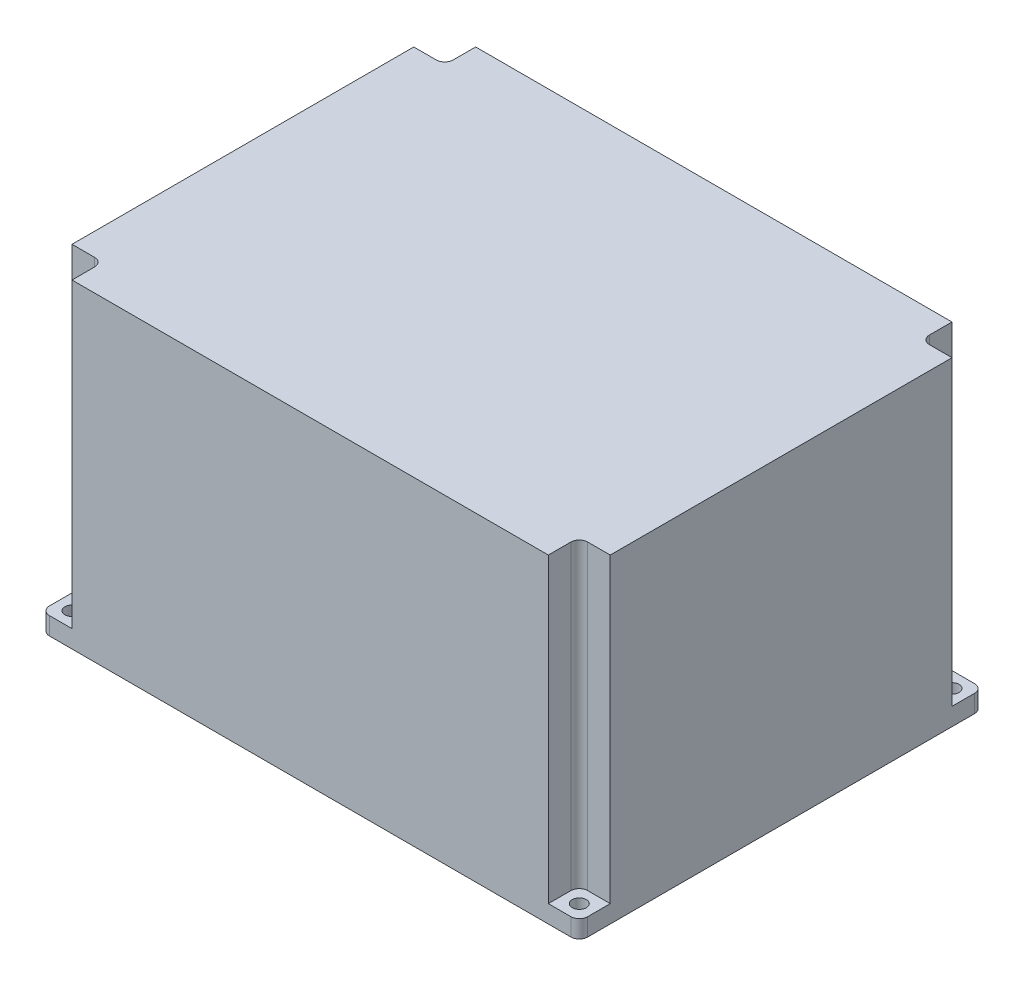
ISO-10303-21;
HEADER;
FILE_DESCRIPTION(('STEP AP214'),'2;1');
FILE_NAME('part.step','',(''),(''),'','','');
FILE_SCHEMA(('AUTOMOTIVE_DESIGN { 1 0 10303 214 1 1 1 1 }'));
ENDSEC;
DATA;
#1=APPLICATION_CONTEXT('core data for automotive mechanical design processes');
#2=APPLICATION_PROTOCOL_DEFINITION('international standard','automotive_design',2000,#1);
#3=PRODUCT_CONTEXT('',#1,'mechanical');
#4=PRODUCT('Part','Part','',(#3));
#5=PRODUCT_RELATED_PRODUCT_CATEGORY('part','',(#4));
#6=PRODUCT_DEFINITION_FORMATION('','',#4);
#7=PRODUCT_DEFINITION_CONTEXT('part definition',#1,'design');
#8=PRODUCT_DEFINITION('design','',#6,#7);
#9=PRODUCT_DEFINITION_SHAPE('','',#8);
#10=(LENGTH_UNIT() NAMED_UNIT(*) SI_UNIT(.MILLI.,.METRE.));
#11=(NAMED_UNIT(*) PLANE_ANGLE_UNIT() SI_UNIT($,.RADIAN.));
#12=(NAMED_UNIT(*) SI_UNIT($,.STERADIAN.) SOLID_ANGLE_UNIT());
#13=UNCERTAINTY_MEASURE_WITH_UNIT(LENGTH_MEASURE(1.E-05),#10,'distance_accuracy_value','');
#14=(GEOMETRIC_REPRESENTATION_CONTEXT(3) GLOBAL_UNCERTAINTY_ASSIGNED_CONTEXT((#13)) GLOBAL_UNIT_ASSIGNED_CONTEXT((#10,
#11,#12)) REPRESENTATION_CONTEXT('',''));
#15=CARTESIAN_POINT('',(0.,0.,0.));
#16=DIRECTION('',(0.,0.,1.));
#17=DIRECTION('',(1.,0.,0.));
#18=AXIS2_PLACEMENT_3D('',#15,#16,#17);
#19=CARTESIAN_POINT('',(51.0260115606936,95.,46.921965317919));
#20=DIRECTION('',(0.,-1.,0.));
#21=DIRECTION('',(0.,0.,-1.));
#22=AXIS2_PLACEMENT_3D('',#19,#20,#21);
#23=CYLINDRICAL_SURFACE('',#22,2.5);
#24=CARTESIAN_POINT('',(51.0260115606936,5.25,46.921965317919));
#25=DIRECTION('',(0.,1.,0.));
#26=DIRECTION('',(0.,0.,1.));
#27=AXIS2_PLACEMENT_3D('',#24,#25,#26);
#28=CIRCLE('',#27,2.5);
#29=CARTESIAN_POINT('',(51.0260115606936,5.25,49.4219653179191));
#30=VERTEX_POINT('',#29);
#31=CARTESIAN_POINT('',(53.5260115606936,5.25,46.921965317919));
#32=VERTEX_POINT('',#31);
#33=EDGE_CURVE('E402',#30,#32,#28,.T.);
#34=ORIENTED_EDGE('',*,*,#33,.F.);
#35=DIRECTION('',(0.,-1.,0.));
#36=VECTOR('',#35,1.);
#37=CARTESIAN_POINT('',(51.0260115606936,95.,49.4219653179191));
#38=LINE('',#37,#36);
#39=CARTESIAN_POINT('',(51.0260115606936,0.,49.4219653179191));
#40=VERTEX_POINT('',#39);
#41=EDGE_CURVE('E423',#30,#40,#38,.T.);
#42=ORIENTED_EDGE('',*,*,#41,.T.);
#43=CARTESIAN_POINT('',(51.0260115606936,0.,46.921965317919));
#44=DIRECTION('',(0.,1.,0.));
#45=DIRECTION('',(0.,0.,1.));
#46=AXIS2_PLACEMENT_3D('',#43,#44,#45);
#47=CIRCLE('',#46,2.5);
#48=CARTESIAN_POINT('',(53.5260115606936,0.,46.921965317919));
#49=VERTEX_POINT('',#48);
#50=EDGE_CURVE('E409',#40,#49,#47,.T.);
#51=ORIENTED_EDGE('',*,*,#50,.T.);
#52=DIRECTION('',(0.,-1.,0.));
#53=VECTOR('',#52,1.);
#54=CARTESIAN_POINT('',(53.5260115606936,95.,46.921965317919));
#55=LINE('',#54,#53);
#56=EDGE_CURVE('E11',#32,#49,#55,.T.);
#57=ORIENTED_EDGE('',*,*,#56,.F.);
#58=EDGE_LOOP('',(#34,#42,#51,#57));
#59=FACE_BOUND('',#58,.T.);
#60=ADVANCED_FACE('F36',(#59),#23,.T.);
#61=CARTESIAN_POINT('',(-103.973988439306,95.,-68.0780346820809));
#62=DIRECTION('',(0.,-1.,0.));
#63=DIRECTION('',(0.,0.,-1.));
#64=AXIS2_PLACEMENT_3D('',#61,#62,#63);
#65=CYLINDRICAL_SURFACE('',#64,2.5);
#66=CARTESIAN_POINT('',(-103.973988439306,5.25,-68.0780346820809));
#67=DIRECTION('',(0.,1.,0.));
#68=DIRECTION('',(0.,0.,1.));
#69=AXIS2_PLACEMENT_3D('',#66,#67,#68);
#70=CIRCLE('',#69,2.5);
#71=CARTESIAN_POINT('',(-103.973988439306,5.25,-70.5780346820809));
#72=VERTEX_POINT('',#71);
#73=CARTESIAN_POINT('',(-106.473988439306,5.25,-68.0780346820809));
#74=VERTEX_POINT('',#73);
#75=EDGE_CURVE('E404',#72,#74,#70,.T.);
#76=ORIENTED_EDGE('',*,*,#75,.F.);
#77=DIRECTION('',(0.,-1.,0.));
#78=VECTOR('',#77,1.);
#79=CARTESIAN_POINT('',(-103.973988439306,95.,-70.5780346820809));
#80=LINE('',#79,#78);
#81=CARTESIAN_POINT('',(-103.973988439306,0.,-70.5780346820809));
#82=VERTEX_POINT('',#81);
#83=EDGE_CURVE('E453',#72,#82,#80,.T.);
#84=ORIENTED_EDGE('',*,*,#83,.T.);
#85=CARTESIAN_POINT('',(-103.973988439306,0.,-68.0780346820809));
#86=DIRECTION('',(0.,1.,0.));
#87=DIRECTION('',(0.,0.,-1.));
#88=AXIS2_PLACEMENT_3D('',#85,#86,#87);
#89=CIRCLE('',#88,2.5);
#90=CARTESIAN_POINT('',(-106.473988439306,0.,-68.0780346820809));
#91=VERTEX_POINT('',#90);
#92=EDGE_CURVE('E435',#82,#91,#89,.T.);
#93=ORIENTED_EDGE('',*,*,#92,.T.);
#94=DIRECTION('',(0.,-1.,0.));
#95=VECTOR('',#94,1.);
#96=CARTESIAN_POINT('',(-106.473988439306,95.,-68.0780346820809));
#97=LINE('',#96,#95);
#98=EDGE_CURVE('E451',#74,#91,#97,.T.);
#99=ORIENTED_EDGE('',*,*,#98,.F.);
#100=EDGE_LOOP('',(#76,#84,#93,#99));
#101=FACE_BOUND('',#100,.T.);
#102=ADVANCED_FACE('F526',(#101),#65,.T.);
#103=CARTESIAN_POINT('',(53.5260115606936,95.,-68.0780346820809));
#104=DIRECTION('',(-1.,0.,0.));
#105=DIRECTION('',(0.,0.,1.));
#106=AXIS2_PLACEMENT_3D('',#103,#104,#105);
#107=PLANE('',#106);
#108=DIRECTION('',(0.,0.,-1.));
#109=VECTOR('',#108,1.);
#110=CARTESIAN_POINT('',(53.5260115606936,95.,-68.0780346820809));
#111=LINE('',#110,#109);
#112=CARTESIAN_POINT('',(53.5260115606936,95.,40.2219653179191));
#113=VERTEX_POINT('',#112);
#114=CARTESIAN_POINT('',(53.5260115606936,95.,-61.3780346820809));
#115=VERTEX_POINT('',#114);
#116=EDGE_CURVE('E410',#113,#115,#111,.T.);
#117=ORIENTED_EDGE('',*,*,#116,.F.);
#118=DIRECTION('',(0.,1.,0.));
#119=VECTOR('',#118,1.);
#120=CARTESIAN_POINT('',(53.5260115606936,5.25,40.2219653179191));
#121=LINE('',#120,#119);
#122=CARTESIAN_POINT('',(53.5260115606936,5.25,40.2219653179191));
#123=VERTEX_POINT('',#122);
#124=EDGE_CURVE('E364',#123,#113,#121,.T.);
#125=ORIENTED_EDGE('',*,*,#124,.F.);
#126=DIRECTION('',(0.,0.,-1.));
#127=VECTOR('',#126,1.);
#128=CARTESIAN_POINT('',(53.5260115606936,5.25,49.4219653179191));
#129=LINE('',#128,#127);
#130=EDGE_CURVE('E352',#32,#123,#129,.T.);
#131=ORIENTED_EDGE('',*,*,#130,.F.);
#132=ORIENTED_EDGE('',*,*,#56,.T.);
#133=DIRECTION('',(0.,0.,-1.));
#134=VECTOR('',#133,1.);
#135=CARTESIAN_POINT('',(53.5260115606936,0.,-68.0780346820809));
#136=LINE('',#135,#134);
#137=CARTESIAN_POINT('',(53.5260115606936,0.,-68.0780346820809));
#138=VERTEX_POINT('',#137);
#139=EDGE_CURVE('E426',#49,#138,#136,.T.);
#140=ORIENTED_EDGE('',*,*,#139,.T.);
#141=DIRECTION('',(0.,-1.,0.));
#142=VECTOR('',#141,1.);
#143=CARTESIAN_POINT('',(53.5260115606936,95.,-68.0780346820809));
#144=LINE('',#143,#142);
#145=CARTESIAN_POINT('',(53.5260115606936,5.25,-68.0780346820809));
#146=VERTEX_POINT('',#145);
#147=EDGE_CURVE('E43',#146,#138,#144,.T.);
#148=ORIENTED_EDGE('',*,*,#147,.F.);
#149=DIRECTION('',(0.,0.,-1.));
#150=VECTOR('',#149,1.);
#151=CARTESIAN_POINT('',(53.5260115606936,5.25,-70.5780346820809));
#152=LINE('',#151,#150);
#153=CARTESIAN_POINT('',(53.5260115606936,5.25,-61.3780346820809));
#154=VERTEX_POINT('',#153);
#155=EDGE_CURVE('E382',#154,#146,#152,.T.);
#156=ORIENTED_EDGE('',*,*,#155,.F.);
#157=DIRECTION('',(0.,1.,0.));
#158=VECTOR('',#157,1.);
#159=CARTESIAN_POINT('',(53.5260115606936,5.25,-61.3780346820809));
#160=LINE('',#159,#158);
#161=EDGE_CURVE('E391',#154,#115,#160,.T.);
#162=ORIENTED_EDGE('',*,*,#161,.T.);
#163=EDGE_LOOP('',(#117,#125,#131,#132,#140,#148,#156,#162));
#164=FACE_BOUND('',#163,.T.);
#165=ADVANCED_FACE('F466',(#164),#107,.F.);
#166=CARTESIAN_POINT('',(51.0260115606936,95.,-68.0780346820809));
#167=DIRECTION('',(0.,-1.,0.));
#168=DIRECTION('',(0.,0.,-1.));
#169=AXIS2_PLACEMENT_3D('',#166,#167,#168);
#170=CYLINDRICAL_SURFACE('',#169,2.5);
#171=DIRECTION('',(0.,-1.,0.));
#172=VECTOR('',#171,1.);
#173=CARTESIAN_POINT('',(51.0260115606936,95.,-70.5780346820809));
#174=LINE('',#173,#172);
#175=CARTESIAN_POINT('',(51.0260115606936,5.25,-70.5780346820809));
#176=VERTEX_POINT('',#175);
#177=CARTESIAN_POINT('',(51.0260115606936,0.,-70.5780346820809));
#178=VERTEX_POINT('',#177);
#179=EDGE_CURVE('E455',#176,#178,#174,.T.);
#180=ORIENTED_EDGE('',*,*,#179,.F.);
#181=CARTESIAN_POINT('',(51.0260115606936,5.25,-68.0780346820809));
#182=DIRECTION('',(0.,-1.,0.));
#183=DIRECTION('',(0.,0.,-1.));
#184=AXIS2_PLACEMENT_3D('',#181,#182,#183);
#185=CIRCLE('',#184,2.5);
#186=EDGE_CURVE('E406',#176,#146,#185,.T.);
#187=ORIENTED_EDGE('',*,*,#186,.T.);
#188=ORIENTED_EDGE('',*,*,#147,.T.);
#189=CARTESIAN_POINT('',(51.0260115606936,0.,-68.0780346820809));
#190=DIRECTION('',(0.,1.,0.));
#191=DIRECTION('',(0.,0.,1.));
#192=AXIS2_PLACEMENT_3D('',#189,#190,#191);
#193=CIRCLE('',#192,2.5);
#194=EDGE_CURVE('E429',#138,#178,#193,.T.);
#195=ORIENTED_EDGE('',*,*,#194,.T.);
#196=EDGE_LOOP('',(#180,#187,#188,#195));
#197=FACE_BOUND('',#196,.T.);
#198=ADVANCED_FACE('F459',(#197),#170,.T.);
#199=CARTESIAN_POINT('',(-103.973988439306,95.,-70.5780346820809));
#200=DIRECTION('',(0.,0.,1.));
#201=DIRECTION('',(1.,0.,0.));
#202=AXIS2_PLACEMENT_3D('',#199,#200,#201);
#203=PLANE('',#202);
#204=DIRECTION('',(-1.,0.,0.));
#205=VECTOR('',#204,1.);
#206=CARTESIAN_POINT('',(-106.473988439306,5.25,-70.5780346820809));
#207=LINE('',#206,#205);
#208=CARTESIAN_POINT('',(-97.2739884393064,5.25,-70.5780346820809));
#209=VERTEX_POINT('',#208);
#210=EDGE_CURVE('E288',#209,#72,#207,.T.);
#211=ORIENTED_EDGE('',*,*,#210,.F.);
#212=DIRECTION('',(0.,1.,0.));
#213=VECTOR('',#212,1.);
#214=CARTESIAN_POINT('',(-97.2739884393064,5.25,-70.5780346820809));
#215=LINE('',#214,#213);
#216=CARTESIAN_POINT('',(-97.2739884393064,95.,-70.5780346820809));
#217=VERTEX_POINT('',#216);
#218=EDGE_CURVE('E308',#209,#217,#215,.T.);
#219=ORIENTED_EDGE('',*,*,#218,.T.);
#220=DIRECTION('',(-1.,0.,0.));
#221=VECTOR('',#220,1.);
#222=CARTESIAN_POINT('',(-103.973988439306,95.,-70.5780346820809));
#223=LINE('',#222,#221);
#224=CARTESIAN_POINT('',(44.3260115606936,95.,-70.5780346820809));
#225=VERTEX_POINT('',#224);
#226=EDGE_CURVE('E413',#225,#217,#223,.T.);
#227=ORIENTED_EDGE('',*,*,#226,.F.);
#228=DIRECTION('',(0.,1.,0.));
#229=VECTOR('',#228,1.);
#230=CARTESIAN_POINT('',(44.3260115606936,5.25,-70.5780346820809));
#231=LINE('',#230,#229);
#232=CARTESIAN_POINT('',(44.3260115606936,5.25,-70.5780346820809));
#233=VERTEX_POINT('',#232);
#234=EDGE_CURVE('E384',#233,#225,#231,.T.);
#235=ORIENTED_EDGE('',*,*,#234,.F.);
#236=DIRECTION('',(-1.,0.,0.));
#237=VECTOR('',#236,1.);
#238=CARTESIAN_POINT('',(53.5260115606936,5.25,-70.5780346820809));
#239=LINE('',#238,#237);
#240=EDGE_CURVE('E370',#176,#233,#239,.T.);
#241=ORIENTED_EDGE('',*,*,#240,.F.);
#242=ORIENTED_EDGE('',*,*,#179,.T.);
#243=DIRECTION('',(-1.,0.,0.));
#244=VECTOR('',#243,1.);
#245=CARTESIAN_POINT('',(-103.973988439306,0.,-70.5780346820809));
#246=LINE('',#245,#244);
#247=EDGE_CURVE('E432',#178,#82,#246,.T.);
#248=ORIENTED_EDGE('',*,*,#247,.T.);
#249=ORIENTED_EDGE('',*,*,#83,.F.);
#250=EDGE_LOOP('',(#211,#219,#227,#235,#241,#242,#248,#249));
#251=FACE_BOUND('',#250,.T.);
#252=ADVANCED_FACE('F477',(#251),#203,.F.);
#253=CARTESIAN_POINT('',(-106.473988439306,95.,-68.0780346820809));
#254=DIRECTION('',(1.,0.,0.));
#255=DIRECTION('',(0.,0.,-1.));
#256=AXIS2_PLACEMENT_3D('',#253,#254,#255);
#257=PLANE('',#256);
#258=DIRECTION('',(0.,0.,1.));
#259=VECTOR('',#258,1.);
#260=CARTESIAN_POINT('',(-106.473988439306,5.25,-55.5780346820809));
#261=LINE('',#260,#259);
#262=CARTESIAN_POINT('',(-106.473988439306,5.25,-55.5780346820809));
#263=VERTEX_POINT('',#262);
#264=CARTESIAN_POINT('',(-106.473988439306,5.25,34.4219653179191));
#265=VERTEX_POINT('',#264);
#266=EDGE_CURVE('E248',#263,#265,#261,.T.);
#267=ORIENTED_EDGE('',*,*,#266,.F.);
#268=DIRECTION('',(0.,-1.,0.));
#269=VECTOR('',#268,1.);
#270=CARTESIAN_POINT('',(-106.473988439306,61.,-55.5780346820809));
#271=LINE('',#270,#269);
#272=CARTESIAN_POINT('',(-106.473988439306,61.,-55.5780346820809));
#273=VERTEX_POINT('',#272);
#274=EDGE_CURVE('E50',#273,#263,#271,.T.);
#275=ORIENTED_EDGE('',*,*,#274,.F.);
#276=DIRECTION('',(0.,0.,-1.));
#277=VECTOR('',#276,1.);
#278=CARTESIAN_POINT('',(-106.473988439306,61.,-55.5780346820809));
#279=LINE('',#278,#277);
#280=CARTESIAN_POINT('',(-106.473988439306,61.,34.4219653179191));
#281=VERTEX_POINT('',#280);
#282=EDGE_CURVE('E239',#281,#273,#279,.T.);
#283=ORIENTED_EDGE('',*,*,#282,.F.);
#284=DIRECTION('',(0.,1.,0.));
#285=VECTOR('',#284,1.);
#286=CARTESIAN_POINT('',(-106.473988439306,61.,34.4219653179191));
#287=LINE('',#286,#285);
#288=EDGE_CURVE('E242',#265,#281,#287,.T.);
#289=ORIENTED_EDGE('',*,*,#288,.F.);
#290=EDGE_LOOP('',(#267,#275,#283,#289));
#291=FACE_BOUND('',#290,.T.);
#292=DIRECTION('',(0.,0.,1.));
#293=VECTOR('',#292,1.);
#294=CARTESIAN_POINT('',(-106.473988439306,5.25,49.4219653179191));
#295=LINE('',#294,#293);
#296=CARTESIAN_POINT('',(-106.473988439306,5.25,40.2219653179191));
#297=VERTEX_POINT('',#296);
#298=CARTESIAN_POINT('',(-106.473988439306,5.25,46.9219653179191));
#299=VERTEX_POINT('',#298);
#300=EDGE_CURVE('E320',#297,#299,#295,.T.);
#301=ORIENTED_EDGE('',*,*,#300,.F.);
#302=DIRECTION('',(0.,1.,0.));
#303=VECTOR('',#302,1.);
#304=CARTESIAN_POINT('',(-106.473988439306,5.25,40.2219653179191));
#305=LINE('',#304,#303);
#306=CARTESIAN_POINT('',(-106.473988439306,95.,40.2219653179191));
#307=VERTEX_POINT('',#306);
#308=EDGE_CURVE('E338',#297,#307,#305,.T.);
#309=ORIENTED_EDGE('',*,*,#308,.T.);
#310=DIRECTION('',(0.,0.,1.));
#311=VECTOR('',#310,1.);
#312=CARTESIAN_POINT('',(-106.473988439306,95.,-68.0780346820809));
#313=LINE('',#312,#311);
#314=CARTESIAN_POINT('',(-106.473988439306,95.,-61.3780346820809));
#315=VERTEX_POINT('',#314);
#316=EDGE_CURVE('E417',#315,#307,#313,.T.);
#317=ORIENTED_EDGE('',*,*,#316,.F.);
#318=DIRECTION('',(0.,1.,0.));
#319=VECTOR('',#318,1.);
#320=CARTESIAN_POINT('',(-106.473988439306,5.25,-61.3780346820809));
#321=LINE('',#320,#319);
#322=CARTESIAN_POINT('',(-106.473988439306,5.25,-61.3780346820809));
#323=VERTEX_POINT('',#322);
#324=EDGE_CURVE('E306',#323,#315,#321,.T.);
#325=ORIENTED_EDGE('',*,*,#324,.F.);
#326=DIRECTION('',(0.,0.,1.));
#327=VECTOR('',#326,1.);
#328=CARTESIAN_POINT('',(-106.473988439306,5.25,-70.5780346820809));
#329=LINE('',#328,#327);
#330=EDGE_CURVE('E290',#74,#323,#329,.T.);
#331=ORIENTED_EDGE('',*,*,#330,.F.);
#332=ORIENTED_EDGE('',*,*,#98,.T.);
#333=DIRECTION('',(0.,0.,1.));
#334=VECTOR('',#333,1.);
#335=CARTESIAN_POINT('',(-106.473988439306,0.,-68.0780346820809));
#336=LINE('',#335,#334);
#337=CARTESIAN_POINT('',(-106.473988439306,0.,46.921965317919));
#338=VERTEX_POINT('',#337);
#339=EDGE_CURVE('E438',#91,#338,#336,.T.);
#340=ORIENTED_EDGE('',*,*,#339,.T.);
#341=DIRECTION('',(0.,-1.,0.));
#342=VECTOR('',#341,1.);
#343=CARTESIAN_POINT('',(-106.473988439306,95.,46.921965317919));
#344=LINE('',#343,#342);
#345=EDGE_CURVE('E449',#299,#338,#344,.T.);
#346=ORIENTED_EDGE('',*,*,#345,.F.);
#347=EDGE_LOOP('',(#301,#309,#317,#325,#331,#332,#340,#346));
#348=FACE_BOUND('',#347,.T.);
#349=ADVANCED_FACE('F520',(#291,#348),#257,.F.);
#350=CARTESIAN_POINT('',(-103.973988439306,95.,46.9219653179191));
#351=DIRECTION('',(0.,-1.,0.));
#352=DIRECTION('',(0.,0.,-1.));
#353=AXIS2_PLACEMENT_3D('',#350,#351,#352);
#354=CYLINDRICAL_SURFACE('',#353,2.5);
#355=DIRECTION('',(0.,-1.,0.));
#356=VECTOR('',#355,1.);
#357=CARTESIAN_POINT('',(-103.973988439306,95.,49.4219653179191));
#358=LINE('',#357,#356);
#359=CARTESIAN_POINT('',(-103.973988439306,5.25,49.4219653179191));
#360=VERTEX_POINT('',#359);
#361=CARTESIAN_POINT('',(-103.973988439306,0.,49.4219653179191));
#362=VERTEX_POINT('',#361);
#363=EDGE_CURVE('E447',#360,#362,#358,.T.);
#364=ORIENTED_EDGE('',*,*,#363,.F.);
#365=CARTESIAN_POINT('',(-103.973988439306,5.25,46.9219653179191));
#366=DIRECTION('',(0.,-1.,0.));
#367=DIRECTION('',(0.,0.,-1.));
#368=AXIS2_PLACEMENT_3D('',#365,#366,#367);
#369=CIRCLE('',#368,2.5);
#370=EDGE_CURVE('E394',#360,#299,#369,.T.);
#371=ORIENTED_EDGE('',*,*,#370,.T.);
#372=ORIENTED_EDGE('',*,*,#345,.T.);
#373=CARTESIAN_POINT('',(-103.973988439306,0.,46.9219653179191));
#374=DIRECTION('',(0.,1.,0.));
#375=DIRECTION('',(0.,0.,-1.));
#376=AXIS2_PLACEMENT_3D('',#373,#374,#375);
#377=CIRCLE('',#376,2.5);
#378=EDGE_CURVE('E441',#338,#362,#377,.T.);
#379=ORIENTED_EDGE('',*,*,#378,.T.);
#380=EDGE_LOOP('',(#364,#371,#372,#379));
#381=FACE_BOUND('',#380,.T.);
#382=ADVANCED_FACE('F516',(#381),#354,.T.);
#383=CARTESIAN_POINT('',(-103.973988439306,95.,49.4219653179191));
#384=DIRECTION('',(0.,0.,-1.));
#385=DIRECTION('',(-1.,0.,0.));
#386=AXIS2_PLACEMENT_3D('',#383,#384,#385);
#387=PLANE('',#386);
#388=DIRECTION('',(1.,0.,0.));
#389=VECTOR('',#388,1.);
#390=CARTESIAN_POINT('',(53.5260115606936,5.25,49.4219653179191));
#391=LINE('',#390,#389);
#392=CARTESIAN_POINT('',(44.3260115606936,5.25,49.4219653179191));
#393=VERTEX_POINT('',#392);
#394=EDGE_CURVE('E350',#393,#30,#391,.T.);
#395=ORIENTED_EDGE('',*,*,#394,.F.);
#396=DIRECTION('',(0.,1.,0.));
#397=VECTOR('',#396,1.);
#398=CARTESIAN_POINT('',(44.3260115606936,5.25,49.4219653179191));
#399=LINE('',#398,#397);
#400=CARTESIAN_POINT('',(44.3260115606936,95.,49.4219653179191));
#401=VERTEX_POINT('',#400);
#402=EDGE_CURVE('E366',#393,#401,#399,.T.);
#403=ORIENTED_EDGE('',*,*,#402,.T.);
#404=DIRECTION('',(1.,0.,0.));
#405=VECTOR('',#404,1.);
#406=CARTESIAN_POINT('',(-103.973988439306,95.,49.4219653179191));
#407=LINE('',#406,#405);
#408=CARTESIAN_POINT('',(-97.2739884393064,95.,49.4219653179191));
#409=VERTEX_POINT('',#408);
#410=EDGE_CURVE('E420',#409,#401,#407,.T.);
#411=ORIENTED_EDGE('',*,*,#410,.F.);
#412=DIRECTION('',(0.,1.,0.));
#413=VECTOR('',#412,1.);
#414=CARTESIAN_POINT('',(-97.2739884393064,5.25,49.4219653179191));
#415=LINE('',#414,#413);
#416=CARTESIAN_POINT('',(-97.2739884393064,5.25,49.4219653179191));
#417=VERTEX_POINT('',#416);
#418=EDGE_CURVE('E336',#417,#409,#415,.T.);
#419=ORIENTED_EDGE('',*,*,#418,.F.);
#420=DIRECTION('',(1.,0.,0.));
#421=VECTOR('',#420,1.);
#422=CARTESIAN_POINT('',(-106.473988439306,5.25,49.4219653179191));
#423=LINE('',#422,#421);
#424=EDGE_CURVE('E322',#360,#417,#423,.T.);
#425=ORIENTED_EDGE('',*,*,#424,.F.);
#426=ORIENTED_EDGE('',*,*,#363,.T.);
#427=DIRECTION('',(1.,0.,0.));
#428=VECTOR('',#427,1.);
#429=CARTESIAN_POINT('',(-103.973988439306,0.,49.4219653179191));
#430=LINE('',#429,#428);
#431=EDGE_CURVE('E414',#362,#40,#430,.T.);
#432=ORIENTED_EDGE('',*,*,#431,.T.);
#433=ORIENTED_EDGE('',*,*,#41,.F.);
#434=EDGE_LOOP('',(#395,#403,#411,#419,#425,#426,#432,#433));
#435=FACE_BOUND('',#434,.T.);
#436=ADVANCED_FACE('F511',(#435),#387,.F.);
#437=CARTESIAN_POINT('',(51.0260115606936,95.,46.921965317919));
#438=DIRECTION('',(0.,1.,0.));
#439=DIRECTION('',(0.,0.,1.));
#440=AXIS2_PLACEMENT_3D('',#437,#438,#439);
#441=PLANE('',#440);
#442=DIRECTION('',(-1.,0.,0.));
#443=VECTOR('',#442,1.);
#444=CARTESIAN_POINT('',(53.5260115606936,95.,40.2219653179191));
#445=LINE('',#444,#443);
#446=CARTESIAN_POINT('',(46.8260115606937,95.,40.2219653179191));
#447=VERTEX_POINT('',#446);
#448=EDGE_CURVE('E347',#113,#447,#445,.T.);
#449=ORIENTED_EDGE('',*,*,#448,.F.);
#450=ORIENTED_EDGE('',*,*,#116,.T.);
#451=DIRECTION('',(1.,0.,0.));
#452=VECTOR('',#451,1.);
#453=CARTESIAN_POINT('',(53.5260115606936,95.,-61.3780346820809));
#454=LINE('',#453,#452);
#455=CARTESIAN_POINT('',(46.8260115606937,95.,-61.3780346820809));
#456=VERTEX_POINT('',#455);
#457=EDGE_CURVE('E373',#456,#115,#454,.T.);
#458=ORIENTED_EDGE('',*,*,#457,.F.);
#459=CARTESIAN_POINT('',(46.8260115606936,95.,-63.8780346820809));
#460=DIRECTION('',(0.,1.,0.));
#461=DIRECTION('',(0.,0.,-1.));
#462=AXIS2_PLACEMENT_3D('',#459,#460,#461);
#463=CIRCLE('',#462,2.5);
#464=CARTESIAN_POINT('',(44.3260115606936,95.,-63.8780346820809));
#465=VERTEX_POINT('',#464);
#466=EDGE_CURVE('E387',#465,#456,#463,.T.);
#467=ORIENTED_EDGE('',*,*,#466,.F.);
#468=DIRECTION('',(0.,0.,1.));
#469=VECTOR('',#468,1.);
#470=CARTESIAN_POINT('',(44.3260115606936,95.,-63.8780346820809));
#471=LINE('',#470,#469);
#472=EDGE_CURVE('E305',#225,#465,#471,.T.);
#473=ORIENTED_EDGE('',*,*,#472,.F.);
#474=ORIENTED_EDGE('',*,*,#226,.T.);
#475=DIRECTION('',(0.,0.,-1.));
#476=VECTOR('',#475,1.);
#477=CARTESIAN_POINT('',(-97.2739884393064,95.,-63.8780346820809));
#478=LINE('',#477,#476);
#479=CARTESIAN_POINT('',(-97.2739884393064,95.,-63.8780346820809));
#480=VERTEX_POINT('',#479);
#481=EDGE_CURVE('E298',#480,#217,#478,.T.);
#482=ORIENTED_EDGE('',*,*,#481,.F.);
#483=CARTESIAN_POINT('',(-99.7739884393064,95.,-63.8780346820809));
#484=DIRECTION('',(0.,1.,0.));
#485=DIRECTION('',(0.,0.,1.));
#486=AXIS2_PLACEMENT_3D('',#483,#484,#485);
#487=CIRCLE('',#486,2.5);
#488=CARTESIAN_POINT('',(-99.7739884393064,95.,-61.3780346820809));
#489=VERTEX_POINT('',#488);
#490=EDGE_CURVE('E296',#489,#480,#487,.T.);
#491=ORIENTED_EDGE('',*,*,#490,.F.);
#492=DIRECTION('',(1.,0.,0.));
#493=VECTOR('',#492,1.);
#494=CARTESIAN_POINT('',(-106.473988439306,95.,-61.3780346820809));
#495=LINE('',#494,#493);
#496=EDGE_CURVE('E285',#315,#489,#495,.T.);
#497=ORIENTED_EDGE('',*,*,#496,.F.);
#498=ORIENTED_EDGE('',*,*,#316,.T.);
#499=DIRECTION('',(-1.,0.,0.));
#500=VECTOR('',#499,1.);
#501=CARTESIAN_POINT('',(-106.473988439306,95.,40.2219653179191));
#502=LINE('',#501,#500);
#503=CARTESIAN_POINT('',(-99.7739884393064,95.,40.2219653179191));
#504=VERTEX_POINT('',#503);
#505=EDGE_CURVE('E330',#504,#307,#502,.T.);
#506=ORIENTED_EDGE('',*,*,#505,.F.);
#507=CARTESIAN_POINT('',(-99.7739884393064,95.,42.7219653179191));
#508=DIRECTION('',(0.,1.,0.));
#509=DIRECTION('',(0.,0.,-1.));
#510=AXIS2_PLACEMENT_3D('',#507,#508,#509);
#511=CIRCLE('',#510,2.5);
#512=CARTESIAN_POINT('',(-97.2739884393064,95.,42.7219653179191));
#513=VERTEX_POINT('',#512);
#514=EDGE_CURVE('E328',#513,#504,#511,.T.);
#515=ORIENTED_EDGE('',*,*,#514,.F.);
#516=DIRECTION('',(0.,0.,-1.));
#517=VECTOR('',#516,1.);
#518=CARTESIAN_POINT('',(-97.2739884393064,95.,42.7219653179191));
#519=LINE('',#518,#517);
#520=EDGE_CURVE('E317',#409,#513,#519,.T.);
#521=ORIENTED_EDGE('',*,*,#520,.F.);
#522=ORIENTED_EDGE('',*,*,#410,.T.);
#523=DIRECTION('',(0.,0.,1.));
#524=VECTOR('',#523,1.);
#525=CARTESIAN_POINT('',(44.3260115606936,95.,42.7219653179191));
#526=LINE('',#525,#524);
#527=CARTESIAN_POINT('',(44.3260115606936,95.,42.7219653179191));
#528=VERTEX_POINT('',#527);
#529=EDGE_CURVE('E359',#528,#401,#526,.T.);
#530=ORIENTED_EDGE('',*,*,#529,.F.);
#531=CARTESIAN_POINT('',(46.8260115606936,95.,42.7219653179191));
#532=DIRECTION('',(0.,1.,0.));
#533=DIRECTION('',(0.,0.,1.));
#534=AXIS2_PLACEMENT_3D('',#531,#532,#533);
#535=CIRCLE('',#534,2.5);
#536=EDGE_CURVE('E58',#447,#528,#535,.T.);
#537=ORIENTED_EDGE('',*,*,#536,.F.);
#538=EDGE_LOOP('',(#449,#450,#458,#467,#473,#474,#482,#491,#497,#498,#506,#515,#521,#522,#530,#537));
#539=FACE_BOUND('',#538,.T.);
#540=ADVANCED_FACE('F497',(#539),#441,.T.);
#541=CARTESIAN_POINT('',(51.0260115606936,0.,46.921965317919));
#542=DIRECTION('',(0.,1.,0.));
#543=DIRECTION('',(0.,0.,1.));
#544=AXIS2_PLACEMENT_3D('',#541,#542,#543);
#545=PLANE('',#544);
#546=CARTESIAN_POINT('',(48.9260115606936,0.,44.8219653179191));
#547=DIRECTION('',(0.,1.,0.));
#548=DIRECTION('',(0.,0.,1.));
#549=AXIS2_PLACEMENT_3D('',#546,#547,#548);
#550=CIRCLE('',#549,2.1);
#551=CARTESIAN_POINT('',(48.9260115606936,0.,46.9219653179191));
#552=VERTEX_POINT('',#551);
#553=EDGE_CURVE('E269',#552,#552,#550,.F.);
#554=ORIENTED_EDGE('',*,*,#553,.F.);
#555=EDGE_LOOP('',(#554));
#556=FACE_BOUND('',#555,.T.);
#557=CARTESIAN_POINT('',(-101.873988439306,0.,44.8219653179191));
#558=DIRECTION('',(0.,1.,0.));
#559=DIRECTION('',(0.,0.,1.));
#560=AXIS2_PLACEMENT_3D('',#557,#558,#559);
#561=CIRCLE('',#560,2.10000000000002);
#562=CARTESIAN_POINT('',(-101.873988439306,0.,46.9219653179191));
#563=VERTEX_POINT('',#562);
#564=EDGE_CURVE('E262',#563,#563,#561,.F.);
#565=ORIENTED_EDGE('',*,*,#564,.F.);
#566=EDGE_LOOP('',(#565));
#567=FACE_BOUND('',#566,.T.);
#568=CARTESIAN_POINT('',(-101.873988439306,0.,-65.9780346820809));
#569=DIRECTION('',(0.,1.,0.));
#570=DIRECTION('',(0.,0.,1.));
#571=AXIS2_PLACEMENT_3D('',#568,#569,#570);
#572=CIRCLE('',#571,2.10000000000002);
#573=CARTESIAN_POINT('',(-101.873988439306,0.,-63.8780346820809));
#574=VERTEX_POINT('',#573);
#575=EDGE_CURVE('E261',#574,#574,#572,.F.);
#576=ORIENTED_EDGE('',*,*,#575,.F.);
#577=EDGE_LOOP('',(#576));
#578=FACE_BOUND('',#577,.T.);
#579=CARTESIAN_POINT('',(48.9260115606936,0.,-65.9780346820809));
#580=DIRECTION('',(0.,1.,0.));
#581=DIRECTION('',(0.,0.,1.));
#582=AXIS2_PLACEMENT_3D('',#579,#580,#581);
#583=CIRCLE('',#582,2.1);
#584=CARTESIAN_POINT('',(48.9260115606936,0.,-63.8780346820809));
#585=VERTEX_POINT('',#584);
#586=EDGE_CURVE('E278',#585,#585,#583,.F.);
#587=ORIENTED_EDGE('',*,*,#586,.F.);
#588=EDGE_LOOP('',(#587));
#589=FACE_BOUND('',#588,.T.);
#590=ORIENTED_EDGE('',*,*,#50,.F.);
#591=ORIENTED_EDGE('',*,*,#431,.F.);
#592=ORIENTED_EDGE('',*,*,#378,.F.);
#593=ORIENTED_EDGE('',*,*,#339,.F.);
#594=ORIENTED_EDGE('',*,*,#92,.F.);
#595=ORIENTED_EDGE('',*,*,#247,.F.);
#596=ORIENTED_EDGE('',*,*,#194,.F.);
#597=ORIENTED_EDGE('',*,*,#139,.F.);
#598=EDGE_LOOP('',(#590,#591,#592,#593,#594,#595,#596,#597));
#599=FACE_BOUND('',#598,.T.);
#600=ADVANCED_FACE('F471',(#556,#567,#578,#589,#599),#545,.F.);
#601=CARTESIAN_POINT('',(46.8260115606936,5.25,-63.8780346820809));
#602=DIRECTION('',(0.,-1.,0.));
#603=DIRECTION('',(0.,0.,-1.));
#604=AXIS2_PLACEMENT_3D('',#601,#602,#603);
#605=PLANE('',#604);
#606=CARTESIAN_POINT('',(48.9260115606936,5.25,-65.9780346820809));
#607=DIRECTION('',(0.,1.,0.));
#608=DIRECTION('',(0.,0.,1.));
#609=AXIS2_PLACEMENT_3D('',#606,#607,#608);
#610=CIRCLE('',#609,2.1);
#611=CARTESIAN_POINT('',(48.9260115606936,5.25,-63.8780346820809));
#612=VERTEX_POINT('',#611);
#613=EDGE_CURVE('E265',#612,#612,#610,.T.);
#614=ORIENTED_EDGE('',*,*,#613,.F.);
#615=EDGE_LOOP('',(#614));
#616=FACE_BOUND('',#615,.T.);
#617=ORIENTED_EDGE('',*,*,#240,.T.);
#618=DIRECTION('',(0.,0.,1.));
#619=VECTOR('',#618,1.);
#620=CARTESIAN_POINT('',(44.3260115606936,5.25,-63.8780346820809));
#621=LINE('',#620,#619);
#622=CARTESIAN_POINT('',(44.3260115606936,5.25,-63.8780346820809));
#623=VERTEX_POINT('',#622);
#624=EDGE_CURVE('E372',#233,#623,#621,.T.);
#625=ORIENTED_EDGE('',*,*,#624,.T.);
#626=CARTESIAN_POINT('',(46.8260115606936,5.25,-63.8780346820809));
#627=DIRECTION('',(0.,1.,0.));
#628=DIRECTION('',(0.,0.,-1.));
#629=AXIS2_PLACEMENT_3D('',#626,#627,#628);
#630=CIRCLE('',#629,2.5);
#631=CARTESIAN_POINT('',(46.8260115606937,5.25,-61.3780346820809));
#632=VERTEX_POINT('',#631);
#633=EDGE_CURVE('E376',#623,#632,#630,.T.);
#634=ORIENTED_EDGE('',*,*,#633,.T.);
#635=DIRECTION('',(1.,0.,0.));
#636=VECTOR('',#635,1.);
#637=CARTESIAN_POINT('',(53.5260115606936,5.25,-61.3780346820809));
#638=LINE('',#637,#636);
#639=EDGE_CURVE('E379',#632,#154,#638,.T.);
#640=ORIENTED_EDGE('',*,*,#639,.T.);
#641=ORIENTED_EDGE('',*,*,#155,.T.);
#642=ORIENTED_EDGE('',*,*,#186,.F.);
#643=EDGE_LOOP('',(#617,#625,#634,#640,#641,#642));
#644=FACE_BOUND('',#643,.T.);
#645=ADVANCED_FACE('F483',(#616,#644),#605,.F.);
#646=CARTESIAN_POINT('',(53.5260115606936,5.25,-61.3780346820809));
#647=DIRECTION('',(0.,0.,1.));
#648=DIRECTION('',(1.,0.,0.));
#649=AXIS2_PLACEMENT_3D('',#646,#647,#648);
#650=PLANE('',#649);
#651=ORIENTED_EDGE('',*,*,#457,.T.);
#652=ORIENTED_EDGE('',*,*,#161,.F.);
#653=ORIENTED_EDGE('',*,*,#639,.F.);
#654=DIRECTION('',(0.,1.,0.));
#655=VECTOR('',#654,1.);
#656=CARTESIAN_POINT('',(46.8260115606937,5.25,-61.3780346820809));
#657=LINE('',#656,#655);
#658=EDGE_CURVE('E395',#632,#456,#657,.T.);
#659=ORIENTED_EDGE('',*,*,#658,.T.);
#660=EDGE_LOOP('',(#651,#652,#653,#659));
#661=FACE_BOUND('',#660,.T.);
#662=ADVANCED_FACE('F634',(#661),#650,.F.);
#663=CARTESIAN_POINT('',(46.8260115606936,5.25,-63.8780346820809));
#664=DIRECTION('',(0.,1.,0.));
#665=DIRECTION('',(0.,0.,1.));
#666=AXIS2_PLACEMENT_3D('',#663,#664,#665);
#667=CYLINDRICAL_SURFACE('',#666,2.5);
#668=ORIENTED_EDGE('',*,*,#466,.T.);
#669=ORIENTED_EDGE('',*,*,#658,.F.);
#670=ORIENTED_EDGE('',*,*,#633,.F.);
#671=DIRECTION('',(0.,1.,0.));
#672=VECTOR('',#671,1.);
#673=CARTESIAN_POINT('',(44.3260115606936,5.25,-63.8780346820809));
#674=LINE('',#673,#672);
#675=EDGE_CURVE('E397',#623,#465,#674,.T.);
#676=ORIENTED_EDGE('',*,*,#675,.T.);
#677=EDGE_LOOP('',(#668,#669,#670,#676));
#678=FACE_BOUND('',#677,.T.);
#679=ADVANCED_FACE('F490',(#678),#667,.F.);
#680=CARTESIAN_POINT('',(44.3260115606936,5.25,-63.8780346820809));
#681=DIRECTION('',(-1.,0.,0.));
#682=DIRECTION('',(0.,0.,1.));
#683=AXIS2_PLACEMENT_3D('',#680,#681,#682);
#684=PLANE('',#683);
#685=ORIENTED_EDGE('',*,*,#472,.T.);
#686=ORIENTED_EDGE('',*,*,#675,.F.);
#687=ORIENTED_EDGE('',*,*,#624,.F.);
#688=ORIENTED_EDGE('',*,*,#234,.T.);
#689=EDGE_LOOP('',(#685,#686,#687,#688));
#690=FACE_BOUND('',#689,.T.);
#691=ADVANCED_FACE('F485',(#690),#684,.F.);
#692=CARTESIAN_POINT('',(-99.7739884393064,5.25,-63.8780346820809));
#693=DIRECTION('',(0.,1.,0.));
#694=DIRECTION('',(0.,0.,1.));
#695=AXIS2_PLACEMENT_3D('',#692,#693,#694);
#696=PLANE('',#695);
#697=CARTESIAN_POINT('',(-101.873988439306,5.25,-65.9780346820809));
#698=DIRECTION('',(0.,1.,0.));
#699=DIRECTION('',(0.,0.,-1.));
#700=AXIS2_PLACEMENT_3D('',#697,#698,#699);
#701=CIRCLE('',#700,2.10000000000002);
#702=CARTESIAN_POINT('',(-101.873988439306,5.25,-68.0780346820809));
#703=VERTEX_POINT('',#702);
#704=EDGE_CURVE('E258',#703,#703,#701,.T.);
#705=ORIENTED_EDGE('',*,*,#704,.F.);
#706=EDGE_LOOP('',(#705));
#707=FACE_BOUND('',#706,.T.);
#708=ORIENTED_EDGE('',*,*,#75,.T.);
#709=ORIENTED_EDGE('',*,*,#330,.T.);
#710=DIRECTION('',(1.,0.,0.));
#711=VECTOR('',#710,1.);
#712=CARTESIAN_POINT('',(-106.473988439306,5.25,-61.3780346820809));
#713=LINE('',#712,#711);
#714=CARTESIAN_POINT('',(-99.7739884393064,5.25,-61.3780346820809));
#715=VERTEX_POINT('',#714);
#716=EDGE_CURVE('E292',#323,#715,#713,.T.);
#717=ORIENTED_EDGE('',*,*,#716,.T.);
#718=CARTESIAN_POINT('',(-99.7739884393064,5.25,-63.8780346820809));
#719=DIRECTION('',(0.,1.,0.));
#720=DIRECTION('',(0.,0.,1.));
#721=AXIS2_PLACEMENT_3D('',#718,#719,#720);
#722=CIRCLE('',#721,2.5);
#723=CARTESIAN_POINT('',(-97.2739884393064,5.25,-63.8780346820809));
#724=VERTEX_POINT('',#723);
#725=EDGE_CURVE('E281',#715,#724,#722,.T.);
#726=ORIENTED_EDGE('',*,*,#725,.T.);
#727=DIRECTION('',(0.,0.,-1.));
#728=VECTOR('',#727,1.);
#729=CARTESIAN_POINT('',(-97.2739884393064,5.25,-63.8780346820809));
#730=LINE('',#729,#728);
#731=EDGE_CURVE('E284',#724,#209,#730,.T.);
#732=ORIENTED_EDGE('',*,*,#731,.T.);
#733=ORIENTED_EDGE('',*,*,#210,.T.);
#734=EDGE_LOOP('',(#708,#709,#717,#726,#732,#733));
#735=FACE_BOUND('',#734,.T.);
#736=ADVANCED_FACE('F528',(#707,#735),#696,.T.);
#737=CARTESIAN_POINT('',(-99.7739884393064,5.25,-63.8780346820809));
#738=DIRECTION('',(0.,1.,0.));
#739=DIRECTION('',(0.,0.,1.));
#740=AXIS2_PLACEMENT_3D('',#737,#738,#739);
#741=CYLINDRICAL_SURFACE('',#740,2.5);
#742=ORIENTED_EDGE('',*,*,#490,.T.);
#743=DIRECTION('',(0.,1.,0.));
#744=VECTOR('',#743,1.);
#745=CARTESIAN_POINT('',(-97.2739884393064,5.25,-63.8780346820809));
#746=LINE('',#745,#744);
#747=EDGE_CURVE('E295',#724,#480,#746,.T.);
#748=ORIENTED_EDGE('',*,*,#747,.F.);
#749=ORIENTED_EDGE('',*,*,#725,.F.);
#750=DIRECTION('',(0.,1.,0.));
#751=VECTOR('',#750,1.);
#752=CARTESIAN_POINT('',(-99.7739884393064,5.25,-61.3780346820809));
#753=LINE('',#752,#751);
#754=EDGE_CURVE('E303',#715,#489,#753,.T.);
#755=ORIENTED_EDGE('',*,*,#754,.T.);
#756=EDGE_LOOP('',(#742,#748,#749,#755));
#757=FACE_BOUND('',#756,.T.);
#758=ADVANCED_FACE('F538',(#757),#741,.F.);
#759=CARTESIAN_POINT('',(-106.473988439306,5.25,-61.3780346820809));
#760=DIRECTION('',(0.,0.,1.));
#761=DIRECTION('',(1.,0.,0.));
#762=AXIS2_PLACEMENT_3D('',#759,#760,#761);
#763=PLANE('',#762);
#764=ORIENTED_EDGE('',*,*,#496,.T.);
#765=ORIENTED_EDGE('',*,*,#754,.F.);
#766=ORIENTED_EDGE('',*,*,#716,.F.);
#767=ORIENTED_EDGE('',*,*,#324,.T.);
#768=EDGE_LOOP('',(#764,#765,#766,#767));
#769=FACE_BOUND('',#768,.T.);
#770=ADVANCED_FACE('F540',(#769),#763,.F.);
#771=CARTESIAN_POINT('',(-97.2739884393064,5.25,-63.8780346820809));
#772=DIRECTION('',(1.,0.,0.));
#773=DIRECTION('',(0.,0.,-1.));
#774=AXIS2_PLACEMENT_3D('',#771,#772,#773);
#775=PLANE('',#774);
#776=ORIENTED_EDGE('',*,*,#481,.T.);
#777=ORIENTED_EDGE('',*,*,#218,.F.);
#778=ORIENTED_EDGE('',*,*,#731,.F.);
#779=ORIENTED_EDGE('',*,*,#747,.T.);
#780=EDGE_LOOP('',(#776,#777,#778,#779));
#781=FACE_BOUND('',#780,.T.);
#782=ADVANCED_FACE('F535',(#781),#775,.F.);
#783=CARTESIAN_POINT('',(-99.7739884393064,5.25,42.7219653179191));
#784=DIRECTION('',(0.,-1.,0.));
#785=DIRECTION('',(0.,0.,-1.));
#786=AXIS2_PLACEMENT_3D('',#783,#784,#785);
#787=PLANE('',#786);
#788=CARTESIAN_POINT('',(-101.873988439306,5.25,44.8219653179191));
#789=DIRECTION('',(0.,1.,0.));
#790=DIRECTION('',(0.,0.,1.));
#791=AXIS2_PLACEMENT_3D('',#788,#789,#790);
#792=CIRCLE('',#791,2.10000000000002);
#793=CARTESIAN_POINT('',(-101.873988439306,5.25,46.9219653179191));
#794=VERTEX_POINT('',#793);
#795=EDGE_CURVE('E266',#794,#794,#792,.T.);
#796=ORIENTED_EDGE('',*,*,#795,.F.);
#797=EDGE_LOOP('',(#796));
#798=FACE_BOUND('',#797,.T.);
#799=ORIENTED_EDGE('',*,*,#424,.T.);
#800=DIRECTION('',(0.,0.,-1.));
#801=VECTOR('',#800,1.);
#802=CARTESIAN_POINT('',(-97.2739884393064,5.25,42.7219653179191));
#803=LINE('',#802,#801);
#804=CARTESIAN_POINT('',(-97.2739884393064,5.25,42.7219653179191));
#805=VERTEX_POINT('',#804);
#806=EDGE_CURVE('E324',#417,#805,#803,.T.);
#807=ORIENTED_EDGE('',*,*,#806,.T.);
#808=CARTESIAN_POINT('',(-99.7739884393064,5.25,42.7219653179191));
#809=DIRECTION('',(0.,1.,0.));
#810=DIRECTION('',(0.,0.,-1.));
#811=AXIS2_PLACEMENT_3D('',#808,#809,#810);
#812=CIRCLE('',#811,2.5);
#813=CARTESIAN_POINT('',(-99.7739884393064,5.25,40.2219653179191));
#814=VERTEX_POINT('',#813);
#815=EDGE_CURVE('E313',#805,#814,#812,.T.);
#816=ORIENTED_EDGE('',*,*,#815,.T.);
#817=DIRECTION('',(-1.,0.,0.));
#818=VECTOR('',#817,1.);
#819=CARTESIAN_POINT('',(-106.473988439306,5.25,40.2219653179191));
#820=LINE('',#819,#818);
#821=EDGE_CURVE('E316',#814,#297,#820,.T.);
#822=ORIENTED_EDGE('',*,*,#821,.T.);
#823=ORIENTED_EDGE('',*,*,#300,.T.);
#824=ORIENTED_EDGE('',*,*,#370,.F.);
#825=EDGE_LOOP('',(#799,#807,#816,#822,#823,#824));
#826=FACE_BOUND('',#825,.T.);
#827=ADVANCED_FACE('F547',(#798,#826),#787,.F.);
#828=CARTESIAN_POINT('',(-99.7739884393064,5.25,42.7219653179191));
#829=DIRECTION('',(0.,1.,0.));
#830=DIRECTION('',(0.,0.,1.));
#831=AXIS2_PLACEMENT_3D('',#828,#829,#830);
#832=CYLINDRICAL_SURFACE('',#831,2.5);
#833=ORIENTED_EDGE('',*,*,#514,.T.);
#834=DIRECTION('',(0.,1.,0.));
#835=VECTOR('',#834,1.);
#836=CARTESIAN_POINT('',(-99.7739884393064,5.25,40.2219653179191));
#837=LINE('',#836,#835);
#838=EDGE_CURVE('E327',#814,#504,#837,.T.);
#839=ORIENTED_EDGE('',*,*,#838,.F.);
#840=ORIENTED_EDGE('',*,*,#815,.F.);
#841=DIRECTION('',(0.,1.,0.));
#842=VECTOR('',#841,1.);
#843=CARTESIAN_POINT('',(-97.2739884393064,5.25,42.7219653179191));
#844=LINE('',#843,#842);
#845=EDGE_CURVE('E299',#805,#513,#844,.T.);
#846=ORIENTED_EDGE('',*,*,#845,.T.);
#847=EDGE_LOOP('',(#833,#839,#840,#846));
#848=FACE_BOUND('',#847,.T.);
#849=ADVANCED_FACE('F551',(#848),#832,.F.);
#850=CARTESIAN_POINT('',(-97.2739884393064,5.25,42.7219653179191));
#851=DIRECTION('',(1.,0.,0.));
#852=DIRECTION('',(0.,0.,-1.));
#853=AXIS2_PLACEMENT_3D('',#850,#851,#852);
#854=PLANE('',#853);
#855=ORIENTED_EDGE('',*,*,#520,.T.);
#856=ORIENTED_EDGE('',*,*,#845,.F.);
#857=ORIENTED_EDGE('',*,*,#806,.F.);
#858=ORIENTED_EDGE('',*,*,#418,.T.);
#859=EDGE_LOOP('',(#855,#856,#857,#858));
#860=FACE_BOUND('',#859,.T.);
#861=ADVANCED_FACE('F691',(#860),#854,.F.);
#862=CARTESIAN_POINT('',(-106.473988439306,5.25,40.2219653179191));
#863=DIRECTION('',(0.,0.,-1.));
#864=DIRECTION('',(-1.,0.,0.));
#865=AXIS2_PLACEMENT_3D('',#862,#863,#864);
#866=PLANE('',#865);
#867=ORIENTED_EDGE('',*,*,#505,.T.);
#868=ORIENTED_EDGE('',*,*,#308,.F.);
#869=ORIENTED_EDGE('',*,*,#821,.F.);
#870=ORIENTED_EDGE('',*,*,#838,.T.);
#871=EDGE_LOOP('',(#867,#868,#869,#870));
#872=FACE_BOUND('',#871,.T.);
#873=ADVANCED_FACE('F545',(#872),#866,.F.);
#874=CARTESIAN_POINT('',(46.8260115606936,5.25,42.7219653179191));
#875=DIRECTION('',(0.,1.,0.));
#876=DIRECTION('',(0.,0.,1.));
#877=AXIS2_PLACEMENT_3D('',#874,#875,#876);
#878=PLANE('',#877);
#879=CARTESIAN_POINT('',(48.9260115606936,5.25,44.8219653179191));
#880=DIRECTION('',(0.,1.,0.));
#881=DIRECTION('',(0.,0.,-1.));
#882=AXIS2_PLACEMENT_3D('',#879,#880,#881);
#883=CIRCLE('',#882,2.1);
#884=CARTESIAN_POINT('',(48.9260115606936,5.25,42.7219653179191));
#885=VERTEX_POINT('',#884);
#886=EDGE_CURVE('E254',#885,#885,#883,.T.);
#887=ORIENTED_EDGE('',*,*,#886,.F.);
#888=EDGE_LOOP('',(#887));
#889=FACE_BOUND('',#888,.T.);
#890=ORIENTED_EDGE('',*,*,#33,.T.);
#891=ORIENTED_EDGE('',*,*,#130,.T.);
#892=DIRECTION('',(-1.,0.,0.));
#893=VECTOR('',#892,1.);
#894=CARTESIAN_POINT('',(53.5260115606936,5.25,40.2219653179191));
#895=LINE('',#894,#893);
#896=CARTESIAN_POINT('',(46.8260115606937,5.25,40.2219653179191));
#897=VERTEX_POINT('',#896);
#898=EDGE_CURVE('E354',#123,#897,#895,.T.);
#899=ORIENTED_EDGE('',*,*,#898,.T.);
#900=CARTESIAN_POINT('',(46.8260115606936,5.25,42.7219653179191));
#901=DIRECTION('',(0.,1.,0.));
#902=DIRECTION('',(0.,0.,1.));
#903=AXIS2_PLACEMENT_3D('',#900,#901,#902);
#904=CIRCLE('',#903,2.5);
#905=CARTESIAN_POINT('',(44.3260115606936,5.25,42.7219653179191));
#906=VERTEX_POINT('',#905);
#907=EDGE_CURVE('E343',#897,#906,#904,.T.);
#908=ORIENTED_EDGE('',*,*,#907,.T.);
#909=DIRECTION('',(0.,0.,1.));
#910=VECTOR('',#909,1.);
#911=CARTESIAN_POINT('',(44.3260115606936,5.25,42.7219653179191));
#912=LINE('',#911,#910);
#913=EDGE_CURVE('E346',#906,#393,#912,.T.);
#914=ORIENTED_EDGE('',*,*,#913,.T.);
#915=ORIENTED_EDGE('',*,*,#394,.T.);
#916=EDGE_LOOP('',(#890,#891,#899,#908,#914,#915));
#917=FACE_BOUND('',#916,.T.);
#918=ADVANCED_FACE('F559',(#889,#917),#878,.T.);
#919=CARTESIAN_POINT('',(46.8260115606936,5.25,42.7219653179191));
#920=DIRECTION('',(0.,1.,0.));
#921=DIRECTION('',(0.,0.,1.));
#922=AXIS2_PLACEMENT_3D('',#919,#920,#921);
#923=CYLINDRICAL_SURFACE('',#922,2.5);
#924=ORIENTED_EDGE('',*,*,#536,.T.);
#925=DIRECTION('',(0.,1.,0.));
#926=VECTOR('',#925,1.);
#927=CARTESIAN_POINT('',(44.3260115606936,5.25,42.7219653179191));
#928=LINE('',#927,#926);
#929=EDGE_CURVE('E357',#906,#528,#928,.T.);
#930=ORIENTED_EDGE('',*,*,#929,.F.);
#931=ORIENTED_EDGE('',*,*,#907,.F.);
#932=DIRECTION('',(0.,1.,0.));
#933=VECTOR('',#932,1.);
#934=CARTESIAN_POINT('',(46.8260115606937,5.25,40.2219653179191));
#935=LINE('',#934,#933);
#936=EDGE_CURVE('E331',#897,#447,#935,.T.);
#937=ORIENTED_EDGE('',*,*,#936,.T.);
#938=EDGE_LOOP('',(#924,#930,#931,#937));
#939=FACE_BOUND('',#938,.T.);
#940=ADVANCED_FACE('F560',(#939),#923,.F.);
#941=CARTESIAN_POINT('',(53.5260115606936,5.25,40.2219653179191));
#942=DIRECTION('',(0.,0.,-1.));
#943=DIRECTION('',(-1.,0.,0.));
#944=AXIS2_PLACEMENT_3D('',#941,#942,#943);
#945=PLANE('',#944);
#946=ORIENTED_EDGE('',*,*,#448,.T.);
#947=ORIENTED_EDGE('',*,*,#936,.F.);
#948=ORIENTED_EDGE('',*,*,#898,.F.);
#949=ORIENTED_EDGE('',*,*,#124,.T.);
#950=EDGE_LOOP('',(#946,#947,#948,#949));
#951=FACE_BOUND('',#950,.T.);
#952=ADVANCED_FACE('F500',(#951),#945,.F.);
#953=CARTESIAN_POINT('',(44.3260115606936,5.25,42.7219653179191));
#954=DIRECTION('',(-1.,0.,0.));
#955=DIRECTION('',(0.,0.,1.));
#956=AXIS2_PLACEMENT_3D('',#953,#954,#955);
#957=PLANE('',#956);
#958=ORIENTED_EDGE('',*,*,#529,.T.);
#959=ORIENTED_EDGE('',*,*,#402,.F.);
#960=ORIENTED_EDGE('',*,*,#913,.F.);
#961=ORIENTED_EDGE('',*,*,#929,.T.);
#962=EDGE_LOOP('',(#958,#959,#960,#961));
#963=FACE_BOUND('',#962,.T.);
#964=ADVANCED_FACE('F558',(#963),#957,.F.);
#965=CARTESIAN_POINT('',(48.9260115606936,-5.93969696196705,44.8219653179191));
#966=DIRECTION('',(0.,1.,0.));
#967=DIRECTION('',(0.,0.,1.));
#968=AXIS2_PLACEMENT_3D('',#965,#966,#967);
#969=CYLINDRICAL_SURFACE('',#968,2.1);
#970=ORIENTED_EDGE('',*,*,#553,.T.);
#971=EDGE_LOOP('',(#970));
#972=FACE_BOUND('',#971,.T.);
#973=ORIENTED_EDGE('',*,*,#886,.T.);
#974=EDGE_LOOP('',(#973));
#975=FACE_BOUND('',#974,.T.);
#976=ADVANCED_FACE('F713',(#972,#975),#969,.F.);
#977=CARTESIAN_POINT('',(-101.873988439306,-5.93969696196705,44.8219653179191));
#978=DIRECTION('',(0.,1.,0.));
#979=DIRECTION('',(0.,0.,1.));
#980=AXIS2_PLACEMENT_3D('',#977,#978,#979);
#981=CYLINDRICAL_SURFACE('',#980,2.10000000000002);
#982=ORIENTED_EDGE('',*,*,#564,.T.);
#983=EDGE_LOOP('',(#982));
#984=FACE_BOUND('',#983,.T.);
#985=ORIENTED_EDGE('',*,*,#795,.T.);
#986=EDGE_LOOP('',(#985));
#987=FACE_BOUND('',#986,.T.);
#988=ADVANCED_FACE('F718',(#984,#987),#981,.F.);
#989=CARTESIAN_POINT('',(-101.873988439306,-5.93969696196705,-65.9780346820809));
#990=DIRECTION('',(0.,1.,0.));
#991=DIRECTION('',(0.,0.,1.));
#992=AXIS2_PLACEMENT_3D('',#989,#990,#991);
#993=CYLINDRICAL_SURFACE('',#992,2.10000000000002);
#994=ORIENTED_EDGE('',*,*,#575,.T.);
#995=EDGE_LOOP('',(#994));
#996=FACE_BOUND('',#995,.T.);
#997=ORIENTED_EDGE('',*,*,#704,.T.);
#998=EDGE_LOOP('',(#997));
#999=FACE_BOUND('',#998,.T.);
#1000=ADVANCED_FACE('F730',(#996,#999),#993,.F.);
#1001=CARTESIAN_POINT('',(48.9260115606936,-5.93969696196705,-65.9780346820809));
#1002=DIRECTION('',(0.,1.,0.));
#1003=DIRECTION('',(0.,0.,1.));
#1004=AXIS2_PLACEMENT_3D('',#1001,#1002,#1003);
#1005=CYLINDRICAL_SURFACE('',#1004,2.1);
#1006=ORIENTED_EDGE('',*,*,#586,.T.);
#1007=EDGE_LOOP('',(#1006));
#1008=FACE_BOUND('',#1007,.T.);
#1009=ORIENTED_EDGE('',*,*,#613,.T.);
#1010=EDGE_LOOP('',(#1009));
#1011=FACE_BOUND('',#1010,.T.);
#1012=ADVANCED_FACE('F739',(#1008,#1011),#1005,.F.);
#1013=CARTESIAN_POINT('',(-105.473988439306,61.,-55.5780346820809));
#1014=DIRECTION('',(0.,0.,-1.));
#1015=DIRECTION('',(-1.,0.,0.));
#1016=AXIS2_PLACEMENT_3D('',#1013,#1014,#1015);
#1017=PLANE('',#1016);
#1018=ORIENTED_EDGE('',*,*,#274,.T.);
#1019=DIRECTION('',(-1.,0.,0.));
#1020=VECTOR('',#1019,1.);
#1021=CARTESIAN_POINT('',(-105.473988439306,5.25,-55.5780346820809));
#1022=LINE('',#1021,#1020);
#1023=CARTESIAN_POINT('',(-105.473988439306,5.25,-55.5780346820809));
#1024=VERTEX_POINT('',#1023);
#1025=EDGE_CURVE('E217',#1024,#263,#1022,.T.);
#1026=ORIENTED_EDGE('',*,*,#1025,.F.);
#1027=DIRECTION('',(0.,-1.,0.));
#1028=VECTOR('',#1027,1.);
#1029=CARTESIAN_POINT('',(-105.473988439306,61.,-55.5780346820809));
#1030=LINE('',#1029,#1028);
#1031=CARTESIAN_POINT('',(-105.473988439306,61.,-55.5780346820809));
#1032=VERTEX_POINT('',#1031);
#1033=EDGE_CURVE('E221',#1032,#1024,#1030,.T.);
#1034=ORIENTED_EDGE('',*,*,#1033,.F.);
#1035=DIRECTION('',(-1.,0.,0.));
#1036=VECTOR('',#1035,1.);
#1037=CARTESIAN_POINT('',(-105.473988439306,61.,-55.5780346820809));
#1038=LINE('',#1037,#1036);
#1039=EDGE_CURVE('E252',#1032,#273,#1038,.T.);
#1040=ORIENTED_EDGE('',*,*,#1039,.T.);
#1041=EDGE_LOOP('',(#1018,#1026,#1034,#1040));
#1042=FACE_BOUND('',#1041,.T.);
#1043=ADVANCED_FACE('F219',(#1042),#1017,.F.);
#1044=CARTESIAN_POINT('',(-105.473988439306,61.,-55.5780346820809));
#1045=DIRECTION('',(0.,1.,0.));
#1046=DIRECTION('',(0.,0.,1.));
#1047=AXIS2_PLACEMENT_3D('',#1044,#1045,#1046);
#1048=PLANE('',#1047);
#1049=ORIENTED_EDGE('',*,*,#282,.T.);
#1050=ORIENTED_EDGE('',*,*,#1039,.F.);
#1051=DIRECTION('',(0.,0.,-1.));
#1052=VECTOR('',#1051,1.);
#1053=CARTESIAN_POINT('',(-105.473988439306,61.,-55.5780346820809));
#1054=LINE('',#1053,#1052);
#1055=CARTESIAN_POINT('',(-105.473988439306,61.,34.4219653179191));
#1056=VERTEX_POINT('',#1055);
#1057=EDGE_CURVE('E227',#1056,#1032,#1054,.T.);
#1058=ORIENTED_EDGE('',*,*,#1057,.F.);
#1059=DIRECTION('',(-1.,0.,0.));
#1060=VECTOR('',#1059,1.);
#1061=CARTESIAN_POINT('',(-105.473988439306,61.,34.4219653179191));
#1062=LINE('',#1061,#1060);
#1063=EDGE_CURVE('E255',#1056,#281,#1062,.T.);
#1064=ORIENTED_EDGE('',*,*,#1063,.T.);
#1065=EDGE_LOOP('',(#1049,#1050,#1058,#1064));
#1066=FACE_BOUND('',#1065,.T.);
#1067=ADVANCED_FACE('F757',(#1066),#1048,.F.);
#1068=CARTESIAN_POINT('',(-105.473988439306,61.,34.4219653179191));
#1069=DIRECTION('',(0.,0.,1.));
#1070=DIRECTION('',(1.,0.,0.));
#1071=AXIS2_PLACEMENT_3D('',#1068,#1069,#1070);
#1072=PLANE('',#1071);
#1073=ORIENTED_EDGE('',*,*,#288,.T.);
#1074=ORIENTED_EDGE('',*,*,#1063,.F.);
#1075=DIRECTION('',(0.,1.,0.));
#1076=VECTOR('',#1075,1.);
#1077=CARTESIAN_POINT('',(-105.473988439306,61.,34.4219653179191));
#1078=LINE('',#1077,#1076);
#1079=CARTESIAN_POINT('',(-105.473988439306,5.25,34.4219653179191));
#1080=VERTEX_POINT('',#1079);
#1081=EDGE_CURVE('E235',#1080,#1056,#1078,.T.);
#1082=ORIENTED_EDGE('',*,*,#1081,.F.);
#1083=DIRECTION('',(-1.,0.,0.));
#1084=VECTOR('',#1083,1.);
#1085=CARTESIAN_POINT('',(-105.473988439306,5.25,34.4219653179191));
#1086=LINE('',#1085,#1084);
#1087=EDGE_CURVE('E226',#1080,#265,#1086,.T.);
#1088=ORIENTED_EDGE('',*,*,#1087,.T.);
#1089=EDGE_LOOP('',(#1073,#1074,#1082,#1088));
#1090=FACE_BOUND('',#1089,.T.);
#1091=ADVANCED_FACE('F763',(#1090),#1072,.F.);
#1092=CARTESIAN_POINT('',(-105.473988439306,5.25,-55.5780346820809));
#1093=DIRECTION('',(0.,-1.,0.));
#1094=DIRECTION('',(0.,0.,-1.));
#1095=AXIS2_PLACEMENT_3D('',#1092,#1093,#1094);
#1096=PLANE('',#1095);
#1097=ORIENTED_EDGE('',*,*,#266,.T.);
#1098=ORIENTED_EDGE('',*,*,#1087,.F.);
#1099=DIRECTION('',(0.,0.,1.));
#1100=VECTOR('',#1099,1.);
#1101=CARTESIAN_POINT('',(-105.473988439306,5.25,-55.5780346820809));
#1102=LINE('',#1101,#1100);
#1103=EDGE_CURVE('E230',#1024,#1080,#1102,.T.);
#1104=ORIENTED_EDGE('',*,*,#1103,.F.);
#1105=ORIENTED_EDGE('',*,*,#1025,.T.);
#1106=EDGE_LOOP('',(#1097,#1098,#1104,#1105));
#1107=FACE_BOUND('',#1106,.T.);
#1108=ADVANCED_FACE('F231',(#1107),#1096,.F.);
#1109=CARTESIAN_POINT('',(-105.473988439306,0.,0.));
#1110=DIRECTION('',(-1.,0.,0.));
#1111=DIRECTION('',(0.,0.,1.));
#1112=AXIS2_PLACEMENT_3D('',#1109,#1110,#1111);
#1113=PLANE('',#1112);
#1114=ORIENTED_EDGE('',*,*,#1033,.T.);
#1115=ORIENTED_EDGE('',*,*,#1103,.T.);
#1116=ORIENTED_EDGE('',*,*,#1081,.T.);
#1117=ORIENTED_EDGE('',*,*,#1057,.T.);
#1118=EDGE_LOOP('',(#1114,#1115,#1116,#1117));
#1119=FACE_BOUND('',#1118,.T.);
#1120=ADVANCED_FACE('F237',(#1119),#1113,.T.);
#1121=CLOSED_SHELL('',(#60,#102,#165,#198,#252,#349,#382,#436,#540,#600,#645,#662,#679,#691,
#736,#758,#770,#782,#827,#849,#861,#873,#918,#940,#952,#964,#976,#988,#1000,#1012,#1043,#1067,
#1091,#1108,#1120));
#1122=MANIFOLD_SOLID_BREP('B2',#1121);
#1123=ADVANCED_BREP_SHAPE_REPRESENTATION('',(#18,#1122),#14);
#1124=SHAPE_DEFINITION_REPRESENTATION(#9,#1123);
ENDSEC;
END-ISO-10303-21;
